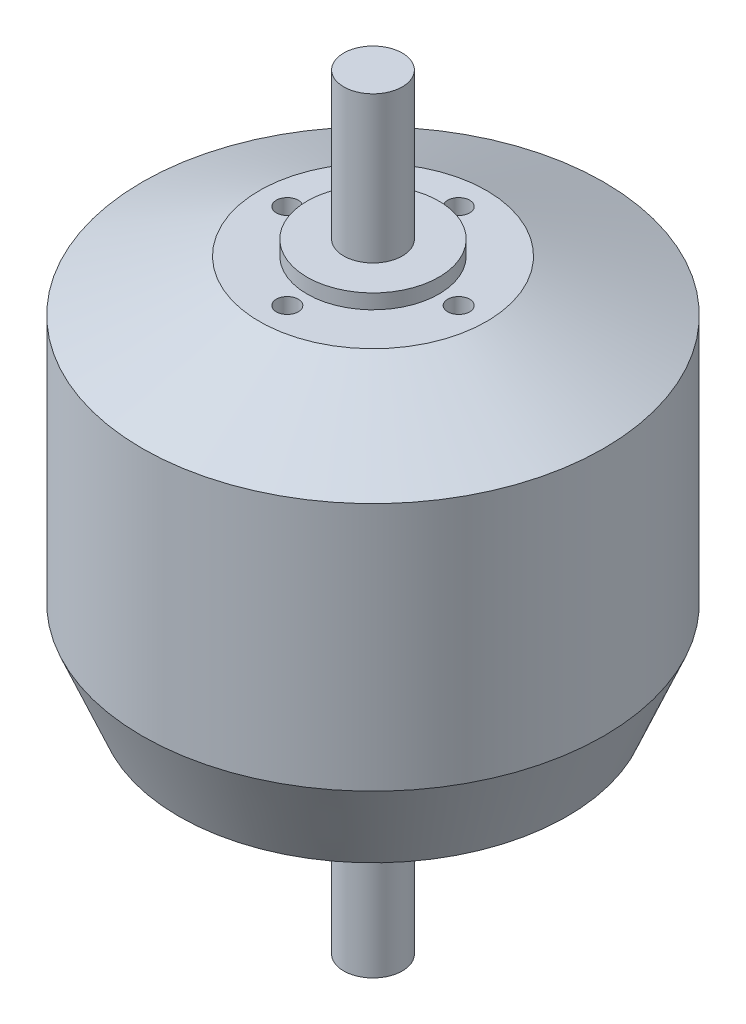
ISO-10303-21;
HEADER;
FILE_DESCRIPTION(('STEP AP214'),'2;1');
FILE_NAME('part.step','',(''),(''),'','','');
FILE_SCHEMA(('AUTOMOTIVE_DESIGN { 1 0 10303 214 1 1 1 1 }'));
ENDSEC;
DATA;
#1=APPLICATION_CONTEXT('core data for automotive mechanical design processes');
#2=APPLICATION_PROTOCOL_DEFINITION('international standard','automotive_design',2000,#1);
#3=PRODUCT_CONTEXT('',#1,'mechanical');
#4=PRODUCT('Part','Part','',(#3));
#5=PRODUCT_RELATED_PRODUCT_CATEGORY('part','',(#4));
#6=PRODUCT_DEFINITION_FORMATION('','',#4);
#7=PRODUCT_DEFINITION_CONTEXT('part definition',#1,'design');
#8=PRODUCT_DEFINITION('design','',#6,#7);
#9=PRODUCT_DEFINITION_SHAPE('','',#8);
#10=(LENGTH_UNIT() NAMED_UNIT(*) SI_UNIT(.MILLI.,.METRE.));
#11=(NAMED_UNIT(*) PLANE_ANGLE_UNIT() SI_UNIT($,.RADIAN.));
#12=(NAMED_UNIT(*) SI_UNIT($,.STERADIAN.) SOLID_ANGLE_UNIT());
#13=UNCERTAINTY_MEASURE_WITH_UNIT(LENGTH_MEASURE(1.E-05),#10,'distance_accuracy_value','');
#14=(GEOMETRIC_REPRESENTATION_CONTEXT(3) GLOBAL_UNCERTAINTY_ASSIGNED_CONTEXT((#13)) GLOBAL_UNIT_ASSIGNED_CONTEXT((#10,
#11,#12)) REPRESENTATION_CONTEXT('',''));
#15=CARTESIAN_POINT('',(0.,0.,0.));
#16=DIRECTION('',(0.,0.,1.));
#17=DIRECTION('',(1.,0.,0.));
#18=AXIS2_PLACEMENT_3D('',#15,#16,#17);
#19=CARTESIAN_POINT('',(0.,55.,0.));
#20=DIRECTION('',(0.,-1.,0.));
#21=DIRECTION('',(0.,0.,-1.));
#22=AXIS2_PLACEMENT_3D('',#19,#20,#21);
#23=CYLINDRICAL_SURFACE('',#22,31.5);
#24=CARTESIAN_POINT('',(0.,46.,0.));
#25=DIRECTION('',(0.,1.,0.));
#26=DIRECTION('',(0.,0.,1.));
#27=AXIS2_PLACEMENT_3D('',#24,#25,#26);
#28=CIRCLE('',#27,31.5);
#29=CARTESIAN_POINT('',(0.,46.,-31.5));
#30=VERTEX_POINT('',#29);
#31=EDGE_CURVE('E45',#30,#30,#28,.F.);
#32=CARTESIAN_POINT('',(0.,12.,0.));
#33=DIRECTION('',(0.,1.,0.));
#34=DIRECTION('',(0.,0.,1.));
#35=AXIS2_PLACEMENT_3D('',#32,#33,#34);
#36=CIRCLE('',#35,31.5);
#37=CARTESIAN_POINT('',(0.,12.,-31.5));
#38=VERTEX_POINT('',#37);
#39=EDGE_CURVE('E115',#38,#38,#36,.T.);
#40=CARTESIAN_POINT('',(0.,46.,-31.5));
#41=CARTESIAN_POINT('',(0.,45.6458333333333,-31.5));
#42=CARTESIAN_POINT('',(0.,45.2916666666667,-31.5));
#43=CARTESIAN_POINT('',(0.,44.5833333333333,-31.5));
#44=CARTESIAN_POINT('',(0.,44.2291666666667,-31.5));
#45=CARTESIAN_POINT('',(0.,43.5208333333333,-31.5));
#46=CARTESIAN_POINT('',(0.,43.1666666666667,-31.5));
#47=CARTESIAN_POINT('',(0.,42.4583333333333,-31.5));
#48=CARTESIAN_POINT('',(0.,42.1041666666667,-31.5));
#49=CARTESIAN_POINT('',(0.,41.3958333333333,-31.5));
#50=CARTESIAN_POINT('',(0.,41.0416666666667,-31.5));
#51=CARTESIAN_POINT('',(0.,40.3333333333333,-31.5));
#52=CARTESIAN_POINT('',(0.,39.9791666666667,-31.5));
#53=CARTESIAN_POINT('',(0.,39.2708333333333,-31.5));
#54=CARTESIAN_POINT('',(0.,38.9166666666667,-31.5));
#55=CARTESIAN_POINT('',(0.,38.2083333333333,-31.5));
#56=CARTESIAN_POINT('',(0.,37.8541666666667,-31.5));
#57=CARTESIAN_POINT('',(0.,37.1458333333333,-31.5));
#58=CARTESIAN_POINT('',(0.,36.7916666666667,-31.5));
#59=CARTESIAN_POINT('',(0.,36.0833333333333,-31.5));
#60=CARTESIAN_POINT('',(0.,35.7291666666667,-31.5));
#61=CARTESIAN_POINT('',(0.,35.0208333333333,-31.5));
#62=CARTESIAN_POINT('',(0.,34.6666666666667,-31.5));
#63=CARTESIAN_POINT('',(0.,33.9583333333333,-31.5));
#64=CARTESIAN_POINT('',(0.,33.6041666666667,-31.5));
#65=CARTESIAN_POINT('',(0.,32.8958333333333,-31.5));
#66=CARTESIAN_POINT('',(0.,32.5416666666667,-31.5));
#67=CARTESIAN_POINT('',(0.,31.8333333333333,-31.5));
#68=CARTESIAN_POINT('',(0.,31.4791666666667,-31.5));
#69=CARTESIAN_POINT('',(0.,30.7708333333333,-31.5));
#70=CARTESIAN_POINT('',(0.,30.4166666666667,-31.5));
#71=CARTESIAN_POINT('',(0.,29.7083333333333,-31.5));
#72=CARTESIAN_POINT('',(0.,29.3541666666667,-31.5));
#73=CARTESIAN_POINT('',(0.,28.6458333333333,-31.5));
#74=CARTESIAN_POINT('',(0.,28.2916666666667,-31.5));
#75=CARTESIAN_POINT('',(0.,27.5833333333333,-31.5));
#76=CARTESIAN_POINT('',(0.,27.2291666666667,-31.5));
#77=CARTESIAN_POINT('',(0.,26.5208333333333,-31.5));
#78=CARTESIAN_POINT('',(0.,26.1666666666667,-31.5));
#79=CARTESIAN_POINT('',(0.,25.4583333333333,-31.5));
#80=CARTESIAN_POINT('',(0.,25.1041666666667,-31.5));
#81=CARTESIAN_POINT('',(0.,24.3958333333333,-31.5));
#82=CARTESIAN_POINT('',(0.,24.0416666666667,-31.5));
#83=CARTESIAN_POINT('',(0.,23.3333333333333,-31.5));
#84=CARTESIAN_POINT('',(0.,22.9791666666667,-31.5));
#85=CARTESIAN_POINT('',(0.,22.2708333333333,-31.5));
#86=CARTESIAN_POINT('',(0.,21.9166666666667,-31.5));
#87=CARTESIAN_POINT('',(0.,21.2083333333333,-31.5));
#88=CARTESIAN_POINT('',(0.,20.8541666666667,-31.5));
#89=CARTESIAN_POINT('',(0.,20.1458333333333,-31.5));
#90=CARTESIAN_POINT('',(0.,19.7916666666667,-31.5));
#91=CARTESIAN_POINT('',(0.,19.0833333333333,-31.5));
#92=CARTESIAN_POINT('',(0.,18.7291666666667,-31.5));
#93=CARTESIAN_POINT('',(0.,18.0208333333333,-31.5));
#94=CARTESIAN_POINT('',(0.,17.6666666666667,-31.5));
#95=CARTESIAN_POINT('',(0.,16.9583333333333,-31.5));
#96=CARTESIAN_POINT('',(0.,16.6041666666667,-31.5));
#97=CARTESIAN_POINT('',(0.,15.8958333333334,-31.5));
#98=CARTESIAN_POINT('',(0.,15.5416666666667,-31.5));
#99=CARTESIAN_POINT('',(0.,14.8333333333333,-31.5));
#100=CARTESIAN_POINT('',(0.,14.4791666666667,-31.5));
#101=CARTESIAN_POINT('',(0.,13.7708333333334,-31.5));
#102=CARTESIAN_POINT('',(0.,13.4166666666667,-31.5));
#103=CARTESIAN_POINT('',(0.,12.7083333333334,-31.5));
#104=CARTESIAN_POINT('',(0.,12.3541666666667,-31.5));
#105=CARTESIAN_POINT('',(0.,12.,-31.5));
#106=B_SPLINE_CURVE_WITH_KNOTS('',3,(#40,#41,#42,#43,#44,#45,#46,#47,#48,#49,#50,#51,#52,#53,
#54,#55,#56,#57,#58,#59,#60,#61,#62,#63,#64,#65,#66,#67,#68,#69,#70,#71,#72,#73,#74,#75,#76,#77,
#78,#79,#80,#81,#82,#83,#84,#85,#86,#87,#88,#89,#90,#91,#92,#93,#94,#95,#96,#97,#98,#99,#100,
#101,#102,#103,#104,#105),.UNSPECIFIED.,.F.,.F.,(4,2,2,2,2,2,2,2,2,2,2,2,2,2,2,2,2,2,2,2,2,2,2,
2,2,2,2,2,2,2,2,2,4),(0.,1.0625,2.125,3.1875,4.25,5.3125,6.375,7.4375,8.49999999999999,
9.56249999999999,10.625,11.6875,12.75,13.8125,14.875,15.9375,17.,18.0625,19.125,20.1875,21.25,
22.3125,23.375,24.4375,25.5,26.5625,27.625,28.6875,29.75,30.8125,31.875,32.9375,34.),.UNSPECIFIED.);
#107=EDGE_CURVE('BSEAM41',#30,#38,#106,.T.);
#108=ORIENTED_EDGE('',*,*,#31,.T.);
#109=ORIENTED_EDGE('',*,*,#39,.T.);
#110=ORIENTED_EDGE('',*,*,#107,.T.);
#111=ORIENTED_EDGE('',*,*,#107,.F.);
#112=EDGE_LOOP('',(#108,#110,#109,#111));
#113=FACE_BOUND('',#112,.T.);
#114=ADVANCED_FACE('F41',(#113),#23,.T.);
#115=CARTESIAN_POINT('',(0.,0.,0.));
#116=DIRECTION('',(0.,1.,0.));
#117=DIRECTION('',(0.,0.,1.));
#118=AXIS2_PLACEMENT_3D('',#115,#116,#117);
#119=PLANE('',#118);
#120=CARTESIAN_POINT('',(0.,0.,0.));
#121=DIRECTION('',(0.,1.,0.));
#122=DIRECTION('',(0.,0.,1.));
#123=AXIS2_PLACEMENT_3D('',#120,#121,#122);
#124=CIRCLE('',#123,26.5);
#125=CARTESIAN_POINT('',(0.,0.,26.5));
#126=VERTEX_POINT('',#125);
#127=EDGE_CURVE('E120',#126,#126,#124,.F.);
#128=ORIENTED_EDGE('',*,*,#127,.T.);
#129=EDGE_LOOP('',(#128));
#130=FACE_BOUND('',#129,.T.);
#131=CARTESIAN_POINT('',(0.,0.,22.2));
#132=DIRECTION('',(0.,1.,0.));
#133=DIRECTION('',(0.,0.,1.));
#134=AXIS2_PLACEMENT_3D('',#131,#132,#133);
#135=CIRCLE('',#134,2.);
#136=CARTESIAN_POINT('',(0.,0.,24.2));
#137=VERTEX_POINT('',#136);
#138=EDGE_CURVE('E86',#137,#137,#135,.T.);
#139=ORIENTED_EDGE('',*,*,#138,.T.);
#140=EDGE_LOOP('',(#139));
#141=FACE_BOUND('',#140,.T.);
#142=CARTESIAN_POINT('',(-22.2,0.,0.));
#143=DIRECTION('',(0.,1.,0.));
#144=DIRECTION('',(0.,0.,1.));
#145=AXIS2_PLACEMENT_3D('',#142,#143,#144);
#146=CIRCLE('',#145,2.);
#147=CARTESIAN_POINT('',(-22.2,0.,2.));
#148=VERTEX_POINT('',#147);
#149=EDGE_CURVE('E92',#148,#148,#146,.T.);
#150=ORIENTED_EDGE('',*,*,#149,.T.);
#151=EDGE_LOOP('',(#150));
#152=FACE_BOUND('',#151,.T.);
#153=CARTESIAN_POINT('',(0.,0.,-22.2));
#154=DIRECTION('',(0.,1.,0.));
#155=DIRECTION('',(0.,0.,1.));
#156=AXIS2_PLACEMENT_3D('',#153,#154,#155);
#157=CIRCLE('',#156,2.);
#158=CARTESIAN_POINT('',(0.,0.,-20.2));
#159=VERTEX_POINT('',#158);
#160=EDGE_CURVE('E98',#159,#159,#157,.T.);
#161=ORIENTED_EDGE('',*,*,#160,.T.);
#162=EDGE_LOOP('',(#161));
#163=FACE_BOUND('',#162,.T.);
#164=CARTESIAN_POINT('',(22.2,0.,0.));
#165=DIRECTION('',(0.,1.,0.));
#166=DIRECTION('',(0.,0.,1.));
#167=AXIS2_PLACEMENT_3D('',#164,#165,#166);
#168=CIRCLE('',#167,2.);
#169=CARTESIAN_POINT('',(22.2,0.,2.));
#170=VERTEX_POINT('',#169);
#171=EDGE_CURVE('E60',#170,#170,#168,.T.);
#172=ORIENTED_EDGE('',*,*,#171,.T.);
#173=EDGE_LOOP('',(#172));
#174=FACE_BOUND('',#173,.T.);
#175=CARTESIAN_POINT('',(0.,0.,0.));
#176=DIRECTION('',(0.,1.,0.));
#177=DIRECTION('',(0.,0.,1.));
#178=AXIS2_PLACEMENT_3D('',#175,#176,#177);
#179=CIRCLE('',#178,4.);
#180=CARTESIAN_POINT('',(0.,0.,4.));
#181=VERTEX_POINT('',#180);
#182=EDGE_CURVE('E85',#181,#181,#179,.T.);
#183=ORIENTED_EDGE('',*,*,#182,.T.);
#184=EDGE_LOOP('',(#183));
#185=FACE_BOUND('',#184,.T.);
#186=ADVANCED_FACE('F143',(#130,#141,#152,#163,#174,#185),#119,.F.);
#187=CARTESIAN_POINT('',(0.,53.,0.));
#188=DIRECTION('',(0.,1.,0.));
#189=DIRECTION('',(0.,0.,1.));
#190=AXIS2_PLACEMENT_3D('',#187,#188,#189);
#191=PLANE('',#190);
#192=CARTESIAN_POINT('',(0.,53.,0.));
#193=DIRECTION('',(0.,1.,0.));
#194=DIRECTION('',(0.,0.,1.));
#195=AXIS2_PLACEMENT_3D('',#192,#193,#194);
#196=CIRCLE('',#195,15.4999999999999);
#197=CARTESIAN_POINT('',(0.,53.,-15.4999999999999));
#198=VERTEX_POINT('',#197);
#199=EDGE_CURVE('E53',#198,#198,#196,.T.);
#200=ORIENTED_EDGE('',*,*,#199,.T.);
#201=EDGE_LOOP('',(#200));
#202=FACE_BOUND('',#201,.T.);
#203=CARTESIAN_POINT('',(-11.7,53.,0.));
#204=DIRECTION('',(0.,1.,0.));
#205=DIRECTION('',(0.,0.,1.));
#206=AXIS2_PLACEMENT_3D('',#203,#204,#205);
#207=CIRCLE('',#206,1.5);
#208=CARTESIAN_POINT('',(-11.7,53.,1.5));
#209=VERTEX_POINT('',#208);
#210=EDGE_CURVE('E61',#209,#209,#207,.T.);
#211=ORIENTED_EDGE('',*,*,#210,.F.);
#212=EDGE_LOOP('',(#211));
#213=FACE_BOUND('',#212,.T.);
#214=CARTESIAN_POINT('',(0.,53.,-11.7));
#215=DIRECTION('',(0.,1.,0.));
#216=DIRECTION('',(0.,0.,1.));
#217=AXIS2_PLACEMENT_3D('',#214,#215,#216);
#218=CIRCLE('',#217,1.5);
#219=CARTESIAN_POINT('',(0.,53.,-10.2));
#220=VERTEX_POINT('',#219);
#221=EDGE_CURVE('E67',#220,#220,#218,.T.);
#222=ORIENTED_EDGE('',*,*,#221,.F.);
#223=EDGE_LOOP('',(#222));
#224=FACE_BOUND('',#223,.T.);
#225=CARTESIAN_POINT('',(11.7,53.,0.));
#226=DIRECTION('',(0.,1.,0.));
#227=DIRECTION('',(0.,0.,1.));
#228=AXIS2_PLACEMENT_3D('',#225,#226,#227);
#229=CIRCLE('',#228,1.5);
#230=CARTESIAN_POINT('',(11.7,53.,1.5));
#231=VERTEX_POINT('',#230);
#232=EDGE_CURVE('E73',#231,#231,#229,.T.);
#233=ORIENTED_EDGE('',*,*,#232,.F.);
#234=EDGE_LOOP('',(#233));
#235=FACE_BOUND('',#234,.T.);
#236=CARTESIAN_POINT('',(0.,53.,11.7));
#237=DIRECTION('',(0.,1.,0.));
#238=DIRECTION('',(0.,0.,1.));
#239=AXIS2_PLACEMENT_3D('',#236,#237,#238);
#240=CIRCLE('',#239,1.5);
#241=CARTESIAN_POINT('',(0.,53.,13.2));
#242=VERTEX_POINT('',#241);
#243=EDGE_CURVE('E79',#242,#242,#240,.T.);
#244=ORIENTED_EDGE('',*,*,#243,.F.);
#245=EDGE_LOOP('',(#244));
#246=FACE_BOUND('',#245,.T.);
#247=CARTESIAN_POINT('',(0.,53.,0.));
#248=DIRECTION('',(0.,1.,0.));
#249=DIRECTION('',(0.,0.,1.));
#250=AXIS2_PLACEMENT_3D('',#247,#248,#249);
#251=CIRCLE('',#250,9.);
#252=CARTESIAN_POINT('',(0.,53.,9.));
#253=VERTEX_POINT('',#252);
#254=EDGE_CURVE('E112',#253,#253,#251,.T.);
#255=ORIENTED_EDGE('',*,*,#254,.F.);
#256=EDGE_LOOP('',(#255));
#257=FACE_BOUND('',#256,.T.);
#258=ADVANCED_FACE('F125',(#202,#213,#224,#235,#246,#257),#191,.T.);
#259=CARTESIAN_POINT('',(0.,53.,0.));
#260=DIRECTION('',(0.,1.,0.));
#261=DIRECTION('',(0.,0.,1.));
#262=AXIS2_PLACEMENT_3D('',#259,#260,#261);
#263=CYLINDRICAL_SURFACE('',#262,9.);
#264=ORIENTED_EDGE('',*,*,#254,.T.);
#265=EDGE_LOOP('',(#264));
#266=FACE_BOUND('',#265,.T.);
#267=CARTESIAN_POINT('',(0.,55.,0.));
#268=DIRECTION('',(0.,1.,0.));
#269=DIRECTION('',(0.,0.,1.));
#270=AXIS2_PLACEMENT_3D('',#267,#268,#269);
#271=CIRCLE('',#270,9.);
#272=CARTESIAN_POINT('',(0.,55.,9.));
#273=VERTEX_POINT('',#272);
#274=EDGE_CURVE('E109',#273,#273,#271,.T.);
#275=ORIENTED_EDGE('',*,*,#274,.F.);
#276=EDGE_LOOP('',(#275));
#277=FACE_BOUND('',#276,.T.);
#278=ADVANCED_FACE('F157',(#266,#277),#263,.T.);
#279=CARTESIAN_POINT('',(0.,55.,0.));
#280=DIRECTION('',(0.,1.,0.));
#281=DIRECTION('',(0.,0.,1.));
#282=AXIS2_PLACEMENT_3D('',#279,#280,#281);
#283=PLANE('',#282);
#284=CARTESIAN_POINT('',(0.,55.,0.));
#285=DIRECTION('',(0.,1.,0.));
#286=DIRECTION('',(0.,0.,1.));
#287=AXIS2_PLACEMENT_3D('',#284,#285,#286);
#288=CIRCLE('',#287,4.);
#289=CARTESIAN_POINT('',(0.,55.,4.));
#290=VERTEX_POINT('',#289);
#291=EDGE_CURVE('E11',#290,#290,#288,.T.);
#292=ORIENTED_EDGE('',*,*,#291,.F.);
#293=EDGE_LOOP('',(#292));
#294=FACE_BOUND('',#293,.T.);
#295=ORIENTED_EDGE('',*,*,#274,.T.);
#296=EDGE_LOOP('',(#295));
#297=FACE_BOUND('',#296,.T.);
#298=ADVANCED_FACE('F153',(#294,#297),#283,.T.);
#299=CARTESIAN_POINT('',(0.,-29.525,0.));
#300=DIRECTION('',(0.,1.,0.));
#301=DIRECTION('',(0.,0.,1.));
#302=AXIS2_PLACEMENT_3D('',#299,#300,#301);
#303=CYLINDRICAL_SURFACE('',#302,4.);
#304=CARTESIAN_POINT('',(0.,-29.525,0.));
#305=DIRECTION('',(0.,1.,0.));
#306=DIRECTION('',(0.,0.,1.));
#307=AXIS2_PLACEMENT_3D('',#304,#305,#306);
#308=CIRCLE('',#307,4.);
#309=CARTESIAN_POINT('',(0.,-29.525,4.));
#310=VERTEX_POINT('',#309);
#311=EDGE_CURVE('E106',#310,#310,#308,.T.);
#312=ORIENTED_EDGE('',*,*,#311,.T.);
#313=EDGE_LOOP('',(#312));
#314=FACE_BOUND('',#313,.T.);
#315=ORIENTED_EDGE('',*,*,#182,.F.);
#316=EDGE_LOOP('',(#315));
#317=FACE_BOUND('',#316,.T.);
#318=ADVANCED_FACE('F156',(#314,#317),#303,.T.);
#319=CARTESIAN_POINT('',(0.,-29.525,0.));
#320=DIRECTION('',(0.,1.,0.));
#321=DIRECTION('',(0.,0.,1.));
#322=AXIS2_PLACEMENT_3D('',#319,#320,#321);
#323=PLANE('',#322);
#324=ORIENTED_EDGE('',*,*,#311,.F.);
#325=EDGE_LOOP('',(#324));
#326=FACE_BOUND('',#325,.T.);
#327=ADVANCED_FACE('F166',(#326),#323,.F.);
#328=CARTESIAN_POINT('',(22.2,10.,0.));
#329=DIRECTION('',(0.,-1.,0.));
#330=DIRECTION('',(0.,0.,-1.));
#331=AXIS2_PLACEMENT_3D('',#328,#329,#330);
#332=CYLINDRICAL_SURFACE('',#331,2.);
#333=CARTESIAN_POINT('',(22.2,10.,0.));
#334=DIRECTION('',(0.,1.,0.));
#335=DIRECTION('',(0.,0.,1.));
#336=AXIS2_PLACEMENT_3D('',#333,#334,#335);
#337=CIRCLE('',#336,2.);
#338=CARTESIAN_POINT('',(22.2,10.,2.));
#339=VERTEX_POINT('',#338);
#340=EDGE_CURVE('E101',#339,#339,#337,.T.);
#341=ORIENTED_EDGE('',*,*,#340,.T.);
#342=EDGE_LOOP('',(#341));
#343=FACE_BOUND('',#342,.T.);
#344=ORIENTED_EDGE('',*,*,#171,.F.);
#345=EDGE_LOOP('',(#344));
#346=FACE_BOUND('',#345,.T.);
#347=ADVANCED_FACE('F170',(#343,#346),#332,.F.);
#348=CARTESIAN_POINT('',(0.,10.,0.));
#349=DIRECTION('',(0.,1.,0.));
#350=DIRECTION('',(0.,0.,1.));
#351=AXIS2_PLACEMENT_3D('',#348,#349,#350);
#352=PLANE('',#351);
#353=ORIENTED_EDGE('',*,*,#340,.F.);
#354=EDGE_LOOP('',(#353));
#355=FACE_BOUND('',#354,.T.);
#356=ADVANCED_FACE('F174',(#355),#352,.F.);
#357=CARTESIAN_POINT('',(0.,10.,-22.2));
#358=DIRECTION('',(0.,-1.,0.));
#359=DIRECTION('',(0.,0.,-1.));
#360=AXIS2_PLACEMENT_3D('',#357,#358,#359);
#361=CYLINDRICAL_SURFACE('',#360,2.);
#362=CARTESIAN_POINT('',(0.,10.,-22.2));
#363=DIRECTION('',(0.,1.,0.));
#364=DIRECTION('',(0.,0.,1.));
#365=AXIS2_PLACEMENT_3D('',#362,#363,#364);
#366=CIRCLE('',#365,2.);
#367=CARTESIAN_POINT('',(0.,10.,-20.2));
#368=VERTEX_POINT('',#367);
#369=EDGE_CURVE('E95',#368,#368,#366,.T.);
#370=ORIENTED_EDGE('',*,*,#369,.T.);
#371=EDGE_LOOP('',(#370));
#372=FACE_BOUND('',#371,.T.);
#373=ORIENTED_EDGE('',*,*,#160,.F.);
#374=EDGE_LOOP('',(#373));
#375=FACE_BOUND('',#374,.T.);
#376=ADVANCED_FACE('F178',(#372,#375),#361,.F.);
#377=CARTESIAN_POINT('',(0.,10.,0.));
#378=DIRECTION('',(0.,1.,0.));
#379=DIRECTION('',(0.,0.,1.));
#380=AXIS2_PLACEMENT_3D('',#377,#378,#379);
#381=PLANE('',#380);
#382=ORIENTED_EDGE('',*,*,#369,.F.);
#383=EDGE_LOOP('',(#382));
#384=FACE_BOUND('',#383,.T.);
#385=ADVANCED_FACE('F182',(#384),#381,.F.);
#386=CARTESIAN_POINT('',(-22.2,10.,0.));
#387=DIRECTION('',(0.,-1.,0.));
#388=DIRECTION('',(0.,0.,-1.));
#389=AXIS2_PLACEMENT_3D('',#386,#387,#388);
#390=CYLINDRICAL_SURFACE('',#389,2.);
#391=CARTESIAN_POINT('',(-22.2,10.,0.));
#392=DIRECTION('',(0.,1.,0.));
#393=DIRECTION('',(0.,0.,1.));
#394=AXIS2_PLACEMENT_3D('',#391,#392,#393);
#395=CIRCLE('',#394,2.);
#396=CARTESIAN_POINT('',(-22.2,10.,2.));
#397=VERTEX_POINT('',#396);
#398=EDGE_CURVE('E89',#397,#397,#395,.T.);
#399=ORIENTED_EDGE('',*,*,#398,.T.);
#400=EDGE_LOOP('',(#399));
#401=FACE_BOUND('',#400,.T.);
#402=ORIENTED_EDGE('',*,*,#149,.F.);
#403=EDGE_LOOP('',(#402));
#404=FACE_BOUND('',#403,.T.);
#405=ADVANCED_FACE('F186',(#401,#404),#390,.F.);
#406=CARTESIAN_POINT('',(0.,10.,0.));
#407=DIRECTION('',(0.,1.,0.));
#408=DIRECTION('',(0.,0.,1.));
#409=AXIS2_PLACEMENT_3D('',#406,#407,#408);
#410=PLANE('',#409);
#411=ORIENTED_EDGE('',*,*,#398,.F.);
#412=EDGE_LOOP('',(#411));
#413=FACE_BOUND('',#412,.T.);
#414=ADVANCED_FACE('F190',(#413),#410,.F.);
#415=CARTESIAN_POINT('',(0.,10.,22.2));
#416=DIRECTION('',(0.,-1.,0.));
#417=DIRECTION('',(0.,0.,-1.));
#418=AXIS2_PLACEMENT_3D('',#415,#416,#417);
#419=CYLINDRICAL_SURFACE('',#418,2.);
#420=CARTESIAN_POINT('',(0.,10.,22.2));
#421=DIRECTION('',(0.,1.,0.));
#422=DIRECTION('',(0.,0.,1.));
#423=AXIS2_PLACEMENT_3D('',#420,#421,#422);
#424=CIRCLE('',#423,2.);
#425=CARTESIAN_POINT('',(0.,10.,24.2));
#426=VERTEX_POINT('',#425);
#427=EDGE_CURVE('E82',#426,#426,#424,.T.);
#428=ORIENTED_EDGE('',*,*,#427,.T.);
#429=EDGE_LOOP('',(#428));
#430=FACE_BOUND('',#429,.T.);
#431=ORIENTED_EDGE('',*,*,#138,.F.);
#432=EDGE_LOOP('',(#431));
#433=FACE_BOUND('',#432,.T.);
#434=ADVANCED_FACE('F194',(#430,#433),#419,.F.);
#435=CARTESIAN_POINT('',(0.,10.,0.));
#436=DIRECTION('',(0.,1.,0.));
#437=DIRECTION('',(0.,0.,1.));
#438=AXIS2_PLACEMENT_3D('',#435,#436,#437);
#439=PLANE('',#438);
#440=ORIENTED_EDGE('',*,*,#427,.F.);
#441=EDGE_LOOP('',(#440));
#442=FACE_BOUND('',#441,.T.);
#443=ADVANCED_FACE('F198',(#442),#439,.F.);
#444=CARTESIAN_POINT('',(0.,48.,11.7));
#445=DIRECTION('',(0.,1.,0.));
#446=DIRECTION('',(0.,0.,1.));
#447=AXIS2_PLACEMENT_3D('',#444,#445,#446);
#448=CYLINDRICAL_SURFACE('',#447,1.5);
#449=CARTESIAN_POINT('',(0.,48.,11.7));
#450=DIRECTION('',(0.,1.,0.));
#451=DIRECTION('',(0.,0.,1.));
#452=AXIS2_PLACEMENT_3D('',#449,#450,#451);
#453=CIRCLE('',#452,1.5);
#454=CARTESIAN_POINT('',(0.,48.,13.2));
#455=VERTEX_POINT('',#454);
#456=EDGE_CURVE('E76',#455,#455,#453,.T.);
#457=ORIENTED_EDGE('',*,*,#456,.F.);
#458=EDGE_LOOP('',(#457));
#459=FACE_BOUND('',#458,.T.);
#460=ORIENTED_EDGE('',*,*,#243,.T.);
#461=EDGE_LOOP('',(#460));
#462=FACE_BOUND('',#461,.T.);
#463=ADVANCED_FACE('F202',(#459,#462),#448,.F.);
#464=CARTESIAN_POINT('',(0.,48.,11.7));
#465=DIRECTION('',(0.,1.,0.));
#466=DIRECTION('',(0.,0.,1.));
#467=AXIS2_PLACEMENT_3D('',#464,#465,#466);
#468=PLANE('',#467);
#469=ORIENTED_EDGE('',*,*,#456,.T.);
#470=EDGE_LOOP('',(#469));
#471=FACE_BOUND('',#470,.T.);
#472=ADVANCED_FACE('F206',(#471),#468,.T.);
#473=CARTESIAN_POINT('',(11.7,48.,0.));
#474=DIRECTION('',(0.,1.,0.));
#475=DIRECTION('',(0.,0.,1.));
#476=AXIS2_PLACEMENT_3D('',#473,#474,#475);
#477=CYLINDRICAL_SURFACE('',#476,1.5);
#478=CARTESIAN_POINT('',(11.7,48.,0.));
#479=DIRECTION('',(0.,1.,0.));
#480=DIRECTION('',(0.,0.,1.));
#481=AXIS2_PLACEMENT_3D('',#478,#479,#480);
#482=CIRCLE('',#481,1.5);
#483=CARTESIAN_POINT('',(11.7,48.,1.5));
#484=VERTEX_POINT('',#483);
#485=EDGE_CURVE('E70',#484,#484,#482,.T.);
#486=ORIENTED_EDGE('',*,*,#485,.F.);
#487=EDGE_LOOP('',(#486));
#488=FACE_BOUND('',#487,.T.);
#489=ORIENTED_EDGE('',*,*,#232,.T.);
#490=EDGE_LOOP('',(#489));
#491=FACE_BOUND('',#490,.T.);
#492=ADVANCED_FACE('F210',(#488,#491),#477,.F.);
#493=CARTESIAN_POINT('',(11.7,48.,0.));
#494=DIRECTION('',(0.,1.,0.));
#495=DIRECTION('',(0.,0.,1.));
#496=AXIS2_PLACEMENT_3D('',#493,#494,#495);
#497=PLANE('',#496);
#498=ORIENTED_EDGE('',*,*,#485,.T.);
#499=EDGE_LOOP('',(#498));
#500=FACE_BOUND('',#499,.T.);
#501=ADVANCED_FACE('F214',(#500),#497,.T.);
#502=CARTESIAN_POINT('',(0.,48.,-11.7));
#503=DIRECTION('',(0.,1.,0.));
#504=DIRECTION('',(0.,0.,1.));
#505=AXIS2_PLACEMENT_3D('',#502,#503,#504);
#506=CYLINDRICAL_SURFACE('',#505,1.5);
#507=CARTESIAN_POINT('',(0.,48.,-11.7));
#508=DIRECTION('',(0.,1.,0.));
#509=DIRECTION('',(0.,0.,1.));
#510=AXIS2_PLACEMENT_3D('',#507,#508,#509);
#511=CIRCLE('',#510,1.5);
#512=CARTESIAN_POINT('',(0.,48.,-10.2));
#513=VERTEX_POINT('',#512);
#514=EDGE_CURVE('E64',#513,#513,#511,.T.);
#515=ORIENTED_EDGE('',*,*,#514,.F.);
#516=EDGE_LOOP('',(#515));
#517=FACE_BOUND('',#516,.T.);
#518=ORIENTED_EDGE('',*,*,#221,.T.);
#519=EDGE_LOOP('',(#518));
#520=FACE_BOUND('',#519,.T.);
#521=ADVANCED_FACE('F218',(#517,#520),#506,.F.);
#522=CARTESIAN_POINT('',(0.,48.,-11.7));
#523=DIRECTION('',(0.,1.,0.));
#524=DIRECTION('',(0.,0.,1.));
#525=AXIS2_PLACEMENT_3D('',#522,#523,#524);
#526=PLANE('',#525);
#527=ORIENTED_EDGE('',*,*,#514,.T.);
#528=EDGE_LOOP('',(#527));
#529=FACE_BOUND('',#528,.T.);
#530=ADVANCED_FACE('F222',(#529),#526,.T.);
#531=CARTESIAN_POINT('',(-11.7,48.,0.));
#532=DIRECTION('',(0.,1.,0.));
#533=DIRECTION('',(0.,0.,1.));
#534=AXIS2_PLACEMENT_3D('',#531,#532,#533);
#535=CYLINDRICAL_SURFACE('',#534,1.5);
#536=CARTESIAN_POINT('',(-11.7,48.,0.));
#537=DIRECTION('',(0.,1.,0.));
#538=DIRECTION('',(0.,0.,1.));
#539=AXIS2_PLACEMENT_3D('',#536,#537,#538);
#540=CIRCLE('',#539,1.5);
#541=CARTESIAN_POINT('',(-11.7,48.,1.5));
#542=VERTEX_POINT('',#541);
#543=EDGE_CURVE('E57',#542,#542,#540,.T.);
#544=ORIENTED_EDGE('',*,*,#543,.F.);
#545=EDGE_LOOP('',(#544));
#546=FACE_BOUND('',#545,.T.);
#547=ORIENTED_EDGE('',*,*,#210,.T.);
#548=EDGE_LOOP('',(#547));
#549=FACE_BOUND('',#548,.T.);
#550=ADVANCED_FACE('F226',(#546,#549),#535,.F.);
#551=CARTESIAN_POINT('',(-11.7,48.,0.));
#552=DIRECTION('',(0.,1.,0.));
#553=DIRECTION('',(0.,0.,1.));
#554=AXIS2_PLACEMENT_3D('',#551,#552,#553);
#555=PLANE('',#554);
#556=ORIENTED_EDGE('',*,*,#543,.T.);
#557=EDGE_LOOP('',(#556));
#558=FACE_BOUND('',#557,.T.);
#559=ADVANCED_FACE('F139',(#558),#555,.T.);
#560=CARTESIAN_POINT('',(0.,12.,0.));
#561=DIRECTION('',(0.,1.,0.));
#562=DIRECTION('',(0.,0.,1.));
#563=AXIS2_PLACEMENT_3D('',#560,#561,#562);
#564=CONICAL_SURFACE('',#563,31.5,0.394791119699759);
#565=ORIENTED_EDGE('',*,*,#127,.F.);
#566=EDGE_LOOP('',(#565));
#567=FACE_BOUND('',#566,.T.);
#568=ORIENTED_EDGE('',*,*,#39,.F.);
#569=EDGE_LOOP('',(#568));
#570=FACE_BOUND('',#569,.T.);
#571=ADVANCED_FACE('F130',(#567,#570),#564,.T.);
#572=CARTESIAN_POINT('',(0.,53.,0.));
#573=DIRECTION('',(0.,-1.,0.));
#574=DIRECTION('',(0.,0.,-1.));
#575=AXIS2_PLACEMENT_3D('',#572,#573,#574);
#576=CONICAL_SURFACE('',#575,15.4999999999999,1.15838588519751);
#577=CARTESIAN_POINT('',(0.,46.,-31.5));
#578=CARTESIAN_POINT('',(0.,46.0729166666667,-31.3333333333333));
#579=CARTESIAN_POINT('',(0.,46.1458333333333,-31.1666666666667));
#580=CARTESIAN_POINT('',(0.,46.2916666666667,-30.8333333333333));
#581=CARTESIAN_POINT('',(0.,46.3645833333333,-30.6666666666667));
#582=CARTESIAN_POINT('',(0.,46.5104166666667,-30.3333333333333));
#583=CARTESIAN_POINT('',(0.,46.5833333333333,-30.1666666666667));
#584=CARTESIAN_POINT('',(0.,46.7291666666667,-29.8333333333333));
#585=CARTESIAN_POINT('',(0.,46.8020833333333,-29.6666666666667));
#586=CARTESIAN_POINT('',(0.,46.9479166666667,-29.3333333333333));
#587=CARTESIAN_POINT('',(0.,47.0208333333333,-29.1666666666667));
#588=CARTESIAN_POINT('',(0.,47.1666666666667,-28.8333333333333));
#589=CARTESIAN_POINT('',(0.,47.2395833333333,-28.6666666666667));
#590=CARTESIAN_POINT('',(0.,47.3854166666667,-28.3333333333333));
#591=CARTESIAN_POINT('',(0.,47.4583333333333,-28.1666666666667));
#592=CARTESIAN_POINT('',(0.,47.6041666666667,-27.8333333333333));
#593=CARTESIAN_POINT('',(0.,47.6770833333333,-27.6666666666667));
#594=CARTESIAN_POINT('',(0.,47.8229166666667,-27.3333333333333));
#595=CARTESIAN_POINT('',(0.,47.8958333333333,-27.1666666666667));
#596=CARTESIAN_POINT('',(0.,48.0416666666667,-26.8333333333333));
#597=CARTESIAN_POINT('',(0.,48.1145833333333,-26.6666666666666));
#598=CARTESIAN_POINT('',(0.,48.2604166666667,-26.3333333333333));
#599=CARTESIAN_POINT('',(0.,48.3333333333333,-26.1666666666666));
#600=CARTESIAN_POINT('',(0.,48.4791666666667,-25.8333333333333));
#601=CARTESIAN_POINT('',(0.,48.5520833333333,-25.6666666666666));
#602=CARTESIAN_POINT('',(0.,48.6979166666667,-25.3333333333333));
#603=CARTESIAN_POINT('',(0.,48.7708333333333,-25.1666666666666));
#604=CARTESIAN_POINT('',(0.,48.9166666666667,-24.8333333333333));
#605=CARTESIAN_POINT('',(0.,48.9895833333333,-24.6666666666666));
#606=CARTESIAN_POINT('',(0.,49.1354166666667,-24.3333333333333));
#607=CARTESIAN_POINT('',(0.,49.2083333333333,-24.1666666666666));
#608=CARTESIAN_POINT('',(0.,49.3541666666667,-23.8333333333333));
#609=CARTESIAN_POINT('',(0.,49.4270833333333,-23.6666666666666));
#610=CARTESIAN_POINT('',(0.,49.5729166666667,-23.3333333333333));
#611=CARTESIAN_POINT('',(0.,49.6458333333333,-23.1666666666666));
#612=CARTESIAN_POINT('',(0.,49.7916666666667,-22.8333333333333));
#613=CARTESIAN_POINT('',(0.,49.8645833333333,-22.6666666666666));
#614=CARTESIAN_POINT('',(0.,50.0104166666667,-22.3333333333333));
#615=CARTESIAN_POINT('',(0.,50.0833333333333,-22.1666666666666));
#616=CARTESIAN_POINT('',(0.,50.2291666666667,-21.8333333333333));
#617=CARTESIAN_POINT('',(0.,50.3020833333333,-21.6666666666666));
#618=CARTESIAN_POINT('',(0.,50.4479166666667,-21.3333333333333));
#619=CARTESIAN_POINT('',(0.,50.5208333333333,-21.1666666666666));
#620=CARTESIAN_POINT('',(0.,50.6666666666667,-20.8333333333333));
#621=CARTESIAN_POINT('',(0.,50.7395833333333,-20.6666666666666));
#622=CARTESIAN_POINT('',(0.,50.8854166666667,-20.3333333333333));
#623=CARTESIAN_POINT('',(0.,50.9583333333333,-20.1666666666666));
#624=CARTESIAN_POINT('',(0.,51.1041666666667,-19.8333333333333));
#625=CARTESIAN_POINT('',(0.,51.1770833333333,-19.6666666666666));
#626=CARTESIAN_POINT('',(0.,51.3229166666667,-19.3333333333333));
#627=CARTESIAN_POINT('',(0.,51.3958333333333,-19.1666666666666));
#628=CARTESIAN_POINT('',(0.,51.5416666666667,-18.8333333333333));
#629=CARTESIAN_POINT('',(0.,51.6145833333333,-18.6666666666666));
#630=CARTESIAN_POINT('',(0.,51.7604166666667,-18.3333333333333));
#631=CARTESIAN_POINT('',(0.,51.8333333333333,-18.1666666666666));
#632=CARTESIAN_POINT('',(0.,51.9791666666667,-17.8333333333333));
#633=CARTESIAN_POINT('',(0.,52.0520833333333,-17.6666666666666));
#634=CARTESIAN_POINT('',(0.,52.1979166666667,-17.3333333333333));
#635=CARTESIAN_POINT('',(0.,52.2708333333333,-17.1666666666666));
#636=CARTESIAN_POINT('',(0.,52.4166666666667,-16.8333333333333));
#637=CARTESIAN_POINT('',(0.,52.4895833333333,-16.6666666666666));
#638=CARTESIAN_POINT('',(0.,52.6354166666667,-16.3333333333333));
#639=CARTESIAN_POINT('',(0.,52.7083333333333,-16.1666666666666));
#640=CARTESIAN_POINT('',(0.,52.8541666666667,-15.8333333333332));
#641=CARTESIAN_POINT('',(0.,52.9270833333333,-15.6666666666666));
#642=CARTESIAN_POINT('',(0.,53.,-15.4999999999999));
#643=B_SPLINE_CURVE_WITH_KNOTS('',3,(#577,#578,#579,#580,#581,#582,#583,#584,#585,#586,#587,
#588,#589,#590,#591,#592,#593,#594,#595,#596,#597,#598,#599,#600,#601,#602,#603,#604,#605,#606,
#607,#608,#609,#610,#611,#612,#613,#614,#615,#616,#617,#618,#619,#620,#621,#622,#623,#624,#625,
#626,#627,#628,#629,#630,#631,#632,#633,#634,#635,#636,#637,#638,#639,#640,#641,#642),
.UNSPECIFIED.,.F.,.F.,(4,2,2,2,2,2,2,2,2,2,2,2,2,2,2,2,2,2,2,2,2,2,2,2,2,2,2,2,2,2,2,2,4),(0.,
0.545757787392914,1.09151557478582,1.63727336217873,2.18303114957164,2.72878893696454,
3.27454672435746,3.82030451175036,4.36606229914327,4.91182008653618,5.45757787392909,
6.003335661322,6.54909344871491,7.09485123610782,7.64060902350072,8.18636681089363,
8.73212459828654,9.27788238567945,9.82364017307236,10.3693979604653,10.9151557478582,
11.4609135352511,12.006671322644,12.5524291100369,13.0981868974298,13.6439446848227,
14.1897024722156,14.7354602596085,15.2812180470014,15.8269758343944,16.3727336217873,
16.9184914091802,17.4642491965731),.UNSPECIFIED.);
#644=EDGE_CURVE('BSEAM43',#30,#198,#643,.T.);
#645=ORIENTED_EDGE('',*,*,#31,.F.);
#646=ORIENTED_EDGE('',*,*,#199,.F.);
#647=ORIENTED_EDGE('',*,*,#644,.T.);
#648=ORIENTED_EDGE('',*,*,#644,.F.);
#649=EDGE_LOOP('',(#645,#647,#646,#648));
#650=FACE_BOUND('',#649,.T.);
#651=ADVANCED_FACE('F43',(#650),#576,.T.);
#652=CARTESIAN_POINT('',(0.,75.,0.));
#653=DIRECTION('',(0.,-1.,0.));
#654=DIRECTION('',(0.,0.,-1.));
#655=AXIS2_PLACEMENT_3D('',#652,#653,#654);
#656=CYLINDRICAL_SURFACE('',#655,4.);
#657=CARTESIAN_POINT('',(0.,75.,0.));
#658=DIRECTION('',(0.,1.,0.));
#659=DIRECTION('',(0.,0.,1.));
#660=AXIS2_PLACEMENT_3D('',#657,#658,#659);
#661=CIRCLE('',#660,4.);
#662=CARTESIAN_POINT('',(0.,75.,4.));
#663=VERTEX_POINT('',#662);
#664=EDGE_CURVE('E56',#663,#663,#661,.T.);
#665=ORIENTED_EDGE('',*,*,#664,.F.);
#666=EDGE_LOOP('',(#665));
#667=FACE_BOUND('',#666,.T.);
#668=ORIENTED_EDGE('',*,*,#291,.T.);
#669=EDGE_LOOP('',(#668));
#670=FACE_BOUND('',#669,.T.);
#671=ADVANCED_FACE('F129',(#667,#670),#656,.T.);
#672=CARTESIAN_POINT('',(0.,75.,0.));
#673=DIRECTION('',(0.,1.,0.));
#674=DIRECTION('',(0.,0.,1.));
#675=AXIS2_PLACEMENT_3D('',#672,#673,#674);
#676=PLANE('',#675);
#677=ORIENTED_EDGE('',*,*,#664,.T.);
#678=EDGE_LOOP('',(#677));
#679=FACE_BOUND('',#678,.T.);
#680=ADVANCED_FACE('F136',(#679),#676,.T.);
#681=CLOSED_SHELL('',(#114,#186,#258,#278,#298,#318,#327,#347,#356,#376,#385,#405,#414,#434,
#443,#463,#472,#492,#501,#521,#530,#550,#559,#571,#651,#671,#680));
#682=MANIFOLD_SOLID_BREP('B2',#681);
#683=ADVANCED_BREP_SHAPE_REPRESENTATION('',(#18,#682),#14);
#684=SHAPE_DEFINITION_REPRESENTATION(#9,#683);
ENDSEC;
END-ISO-10303-21;
